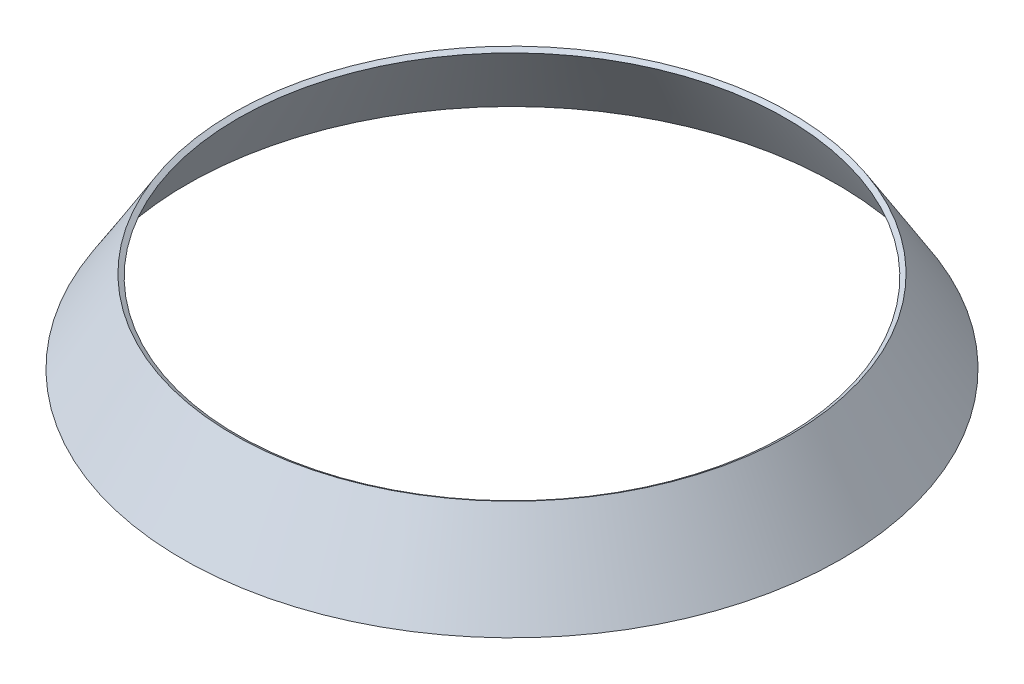
ISO-10303-21;
HEADER;
FILE_DESCRIPTION(('STEP AP214'),'2;1');
FILE_NAME('part.step','',(''),(''),'','','');
FILE_SCHEMA(('AUTOMOTIVE_DESIGN { 1 0 10303 214 1 1 1 1 }'));
ENDSEC;
DATA;
#1=APPLICATION_CONTEXT('core data for automotive mechanical design processes');
#2=APPLICATION_PROTOCOL_DEFINITION('international standard','automotive_design',2000,#1);
#3=PRODUCT_CONTEXT('',#1,'mechanical');
#4=PRODUCT('Part','Part','',(#3));
#5=PRODUCT_RELATED_PRODUCT_CATEGORY('part','',(#4));
#6=PRODUCT_DEFINITION_FORMATION('','',#4);
#7=PRODUCT_DEFINITION_CONTEXT('part definition',#1,'design');
#8=PRODUCT_DEFINITION('design','',#6,#7);
#9=PRODUCT_DEFINITION_SHAPE('','',#8);
#10=(LENGTH_UNIT() NAMED_UNIT(*) SI_UNIT(.MILLI.,.METRE.));
#11=(NAMED_UNIT(*) PLANE_ANGLE_UNIT() SI_UNIT($,.RADIAN.));
#12=(NAMED_UNIT(*) SI_UNIT($,.STERADIAN.) SOLID_ANGLE_UNIT());
#13=UNCERTAINTY_MEASURE_WITH_UNIT(LENGTH_MEASURE(1.E-05),#10,'distance_accuracy_value','');
#14=(GEOMETRIC_REPRESENTATION_CONTEXT(3) GLOBAL_UNCERTAINTY_ASSIGNED_CONTEXT((#13)) GLOBAL_UNIT_ASSIGNED_CONTEXT((#10,
#11,#12)) REPRESENTATION_CONTEXT('',''));
#15=CARTESIAN_POINT('',(0.,0.,0.));
#16=DIRECTION('',(0.,0.,1.));
#17=DIRECTION('',(1.,0.,0.));
#18=AXIS2_PLACEMENT_3D('',#15,#16,#17);
#19=CARTESIAN_POINT('',(0.,5.71418728913131,0.));
#20=DIRECTION('',(0.,1.,0.));
#21=DIRECTION('',(-1.,0.,0.));
#22=AXIS2_PLACEMENT_3D('',#19,#20,#21);
#23=CONICAL_SURFACE('',#22,37.4233968849884,1.01752695391269);
#24=CARTESIAN_POINT('',(0.,5.34635713338072,0.));
#25=DIRECTION('',(0.,-1.,0.));
#26=DIRECTION('',(1.,0.,0.));
#27=AXIS2_PLACEMENT_3D('',#24,#25,#26);
#28=CIRCLE('',#27,36.8278291083915);
#29=CARTESIAN_POINT('',(36.8278291083915,5.34635713338085,0.));
#30=VERTEX_POINT('',#29);
#31=EDGE_CURVE('E10',#30,#30,#28,.T.);
#32=ORIENTED_EDGE('',*,*,#31,.T.);
#33=EDGE_LOOP('',(#32));
#34=FACE_BOUND('',#33,.T.);
#35=CARTESIAN_POINT('',(0.,5.71418728913131,0.));
#36=DIRECTION('',(0.,-1.,0.));
#37=DIRECTION('',(1.,0.,0.));
#38=AXIS2_PLACEMENT_3D('',#35,#36,#37);
#39=CIRCLE('',#38,37.4233968849884);
#40=CARTESIAN_POINT('',(37.4233968849883,5.71418728913144,0.));
#41=VERTEX_POINT('',#40);
#42=EDGE_CURVE('E46',#41,#41,#39,.T.);
#43=ORIENTED_EDGE('',*,*,#42,.F.);
#44=EDGE_LOOP('',(#43));
#45=FACE_BOUND('',#44,.T.);
#46=ADVANCED_FACE('F32',(#34,#45),#23,.F.);
#47=CARTESIAN_POINT('',(0.,5.34635713338072,0.));
#48=DIRECTION('',(0.,-1.,0.));
#49=DIRECTION('',(1.,0.,0.));
#50=AXIS2_PLACEMENT_3D('',#47,#48,#49);
#51=CONICAL_SURFACE('',#50,36.8278291083915,0.553269372882191);
#52=CARTESIAN_POINT('',(0.,-5.71418728913198,0.));
#53=DIRECTION('',(0.,-1.,0.));
#54=DIRECTION('',(1.,0.,0.));
#55=AXIS2_PLACEMENT_3D('',#52,#53,#54);
#56=CIRCLE('',#55,43.6589605723309);
#57=CARTESIAN_POINT('',(43.6589605723309,-5.71418728913183,0.));
#58=VERTEX_POINT('',#57);
#59=EDGE_CURVE('E38',#58,#58,#56,.T.);
#60=ORIENTED_EDGE('',*,*,#59,.T.);
#61=EDGE_LOOP('',(#60));
#62=FACE_BOUND('',#61,.T.);
#63=ORIENTED_EDGE('',*,*,#31,.F.);
#64=EDGE_LOOP('',(#63));
#65=FACE_BOUND('',#64,.T.);
#66=ADVANCED_FACE('F56',(#62,#65),#51,.F.);
#67=CARTESIAN_POINT('',(0.,-5.71418728913198,0.));
#68=DIRECTION('',(0.,1.,0.));
#69=DIRECTION('',(-1.,0.,0.));
#70=AXIS2_PLACEMENT_3D('',#67,#68,#69);
#71=CONICAL_SURFACE('',#70,43.6589605723309,1.01752695391269);
#72=CARTESIAN_POINT('',(0.,-5.34635713338139,0.));
#73=DIRECTION('',(0.,-1.,0.));
#74=DIRECTION('',(1.,0.,0.));
#75=AXIS2_PLACEMENT_3D('',#72,#73,#74);
#76=CIRCLE('',#75,44.2545283489277);
#77=CARTESIAN_POINT('',(44.2545283489277,-5.34635713338123,0.));
#78=VERTEX_POINT('',#77);
#79=EDGE_CURVE('E42',#78,#78,#76,.T.);
#80=ORIENTED_EDGE('',*,*,#79,.T.);
#81=EDGE_LOOP('',(#80));
#82=FACE_BOUND('',#81,.T.);
#83=ORIENTED_EDGE('',*,*,#59,.F.);
#84=EDGE_LOOP('',(#83));
#85=FACE_BOUND('',#84,.T.);
#86=ADVANCED_FACE('F60',(#82,#85),#71,.T.);
#87=CARTESIAN_POINT('',(0.,-5.34635713338139,0.));
#88=DIRECTION('',(0.,-1.,0.));
#89=DIRECTION('',(1.,0.,0.));
#90=AXIS2_PLACEMENT_3D('',#87,#88,#89);
#91=CONICAL_SURFACE('',#90,44.2545283489277,0.553269372882191);
#92=ORIENTED_EDGE('',*,*,#42,.T.);
#93=EDGE_LOOP('',(#92));
#94=FACE_BOUND('',#93,.T.);
#95=ORIENTED_EDGE('',*,*,#79,.F.);
#96=EDGE_LOOP('',(#95));
#97=FACE_BOUND('',#96,.T.);
#98=ADVANCED_FACE('F52',(#94,#97),#91,.T.);
#99=CLOSED_SHELL('',(#46,#66,#86,#98));
#100=MANIFOLD_SOLID_BREP('B2',#99);
#101=ADVANCED_BREP_SHAPE_REPRESENTATION('',(#18,#100),#14);
#102=SHAPE_DEFINITION_REPRESENTATION(#9,#101);
ENDSEC;
END-ISO-10303-21;
